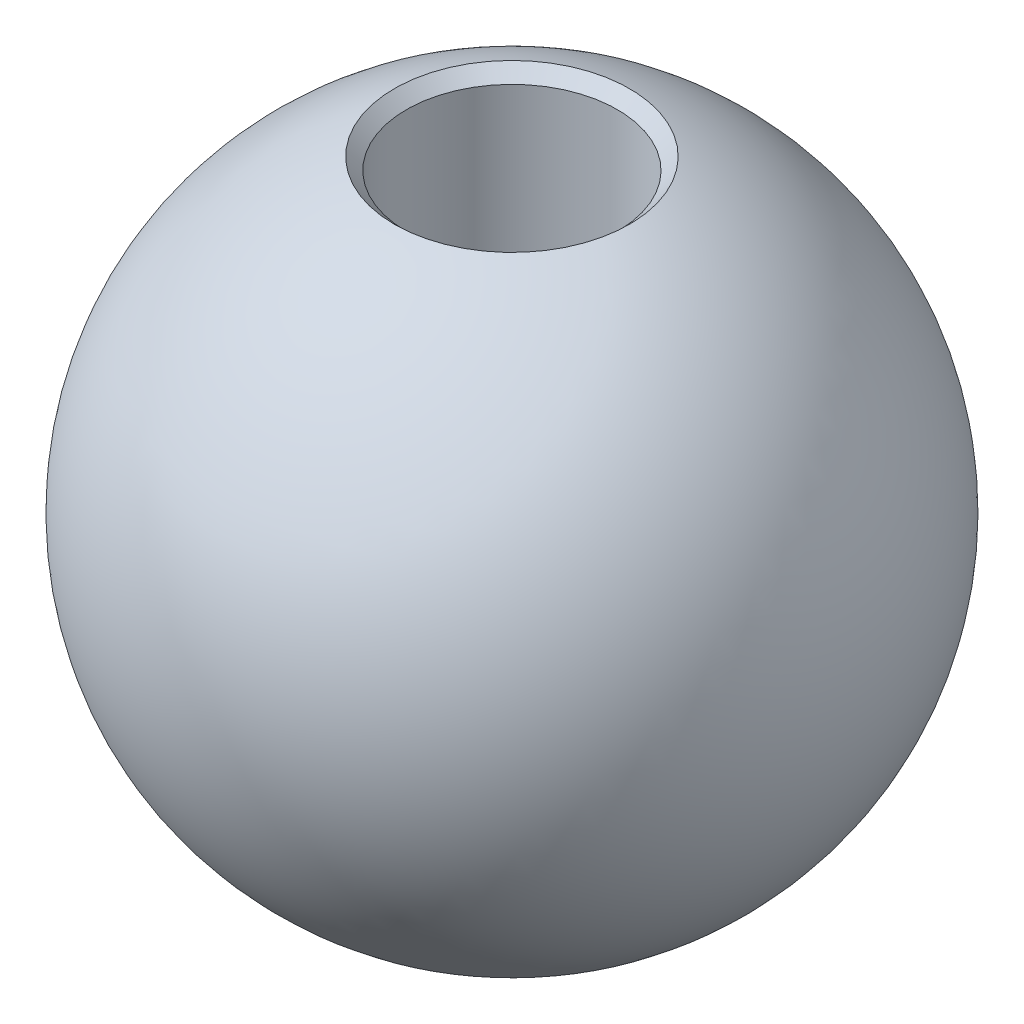
ISO-10303-21;
HEADER;
FILE_DESCRIPTION(('STEP AP214'),'2;1');
FILE_NAME('part.step','',(''),(''),'','','');
FILE_SCHEMA(('AUTOMOTIVE_DESIGN { 1 0 10303 214 1 1 1 1 }'));
ENDSEC;
DATA;
#1=APPLICATION_CONTEXT('core data for automotive mechanical design processes');
#2=APPLICATION_PROTOCOL_DEFINITION('international standard','automotive_design',2000,#1);
#3=PRODUCT_CONTEXT('',#1,'mechanical');
#4=PRODUCT('Part','Part','',(#3));
#5=PRODUCT_RELATED_PRODUCT_CATEGORY('part','',(#4));
#6=PRODUCT_DEFINITION_FORMATION('','',#4);
#7=PRODUCT_DEFINITION_CONTEXT('part definition',#1,'design');
#8=PRODUCT_DEFINITION('design','',#6,#7);
#9=PRODUCT_DEFINITION_SHAPE('','',#8);
#10=(LENGTH_UNIT() NAMED_UNIT(*) SI_UNIT(.MILLI.,.METRE.));
#11=(NAMED_UNIT(*) PLANE_ANGLE_UNIT() SI_UNIT($,.RADIAN.));
#12=(NAMED_UNIT(*) SI_UNIT($,.STERADIAN.) SOLID_ANGLE_UNIT());
#13=UNCERTAINTY_MEASURE_WITH_UNIT(LENGTH_MEASURE(1.E-05),#10,'distance_accuracy_value','');
#14=(GEOMETRIC_REPRESENTATION_CONTEXT(3) GLOBAL_UNCERTAINTY_ASSIGNED_CONTEXT((#13)) GLOBAL_UNIT_ASSIGNED_CONTEXT((#10,
#11,#12)) REPRESENTATION_CONTEXT('',''));
#15=CARTESIAN_POINT('',(0.,0.,0.));
#16=DIRECTION('',(0.,0.,1.));
#17=DIRECTION('',(1.,0.,0.));
#18=AXIS2_PLACEMENT_3D('',#15,#16,#17);
#19=CARTESIAN_POINT('',(0.,0.,0.));
#20=DIRECTION('',(-1.,0.,0.));
#21=DIRECTION('',(0.,1.,0.));
#22=AXIS2_PLACEMENT_3D('',#19,#20,#21);
#23=SPHERICAL_SURFACE('',#22,5.);
#24=CARTESIAN_POINT('',(0.,0.,0.));
#25=DIRECTION('',(0.,1.,0.));
#26=DIRECTION('',(0.,0.,1.));
#27=AXIS2_PLACEMENT_3D('',#24,#25,#26);
#28=SPHERICAL_SURFACE('',#27,5.);
#29=CARTESIAN_POINT('',(0.,-4.67095475910253,0.));
#30=DIRECTION('',(0.,1.,0.));
#31=DIRECTION('',(0.,0.,1.));
#32=AXIS2_PLACEMENT_3D('',#29,#30,#31);
#33=CIRCLE('',#32,1.78386704617172);
#34=CARTESIAN_POINT('',(0.,-4.67095475910253,1.78386704617172));
#35=VERTEX_POINT('',#34);
#36=EDGE_CURVE('E54',#35,#35,#33,.T.);
#37=ORIENTED_EDGE('',*,*,#36,.T.);
#38=EDGE_LOOP('',(#37));
#39=FACE_BOUND('',#38,.T.);
#40=CARTESIAN_POINT('',(0.,4.67095475910253,0.));
#41=DIRECTION('',(0.,-1.,0.));
#42=DIRECTION('',(0.,0.,-1.));
#43=AXIS2_PLACEMENT_3D('',#40,#41,#42);
#44=CIRCLE('',#43,1.78386704617172);
#45=CARTESIAN_POINT('',(0.,4.67095475910253,1.78386704617172));
#46=VERTEX_POINT('',#45);
#47=EDGE_CURVE('E59',#46,#46,#44,.T.);
#48=ORIENTED_EDGE('',*,*,#47,.T.);
#49=EDGE_LOOP('',(#48));
#50=FACE_BOUND('',#49,.T.);
#51=ADVANCED_FACE('F40',(#39,#50),#28,.T.);
#52=CARTESIAN_POINT('',(0.,5.,0.));
#53=DIRECTION('',(0.,1.,0.));
#54=DIRECTION('',(0.,0.,1.));
#55=AXIS2_PLACEMENT_3D('',#52,#53,#54);
#56=CYLINDRICAL_SURFACE('',#55,1.59999999999999);
#57=CARTESIAN_POINT('',(0.,-4.4870877129308,0.));
#58=DIRECTION('',(0.,1.,0.));
#59=DIRECTION('',(0.,0.,1.));
#60=AXIS2_PLACEMENT_3D('',#57,#58,#59);
#61=CIRCLE('',#60,1.59999999999999);
#62=CARTESIAN_POINT('',(0.,-4.4870877129308,1.59999999999999));
#63=VERTEX_POINT('',#62);
#64=EDGE_CURVE('E10',#63,#63,#61,.F.);
#65=ORIENTED_EDGE('',*,*,#64,.T.);
#66=EDGE_LOOP('',(#65));
#67=FACE_BOUND('',#66,.T.);
#68=CARTESIAN_POINT('',(0.,4.4870877129308,0.));
#69=DIRECTION('',(0.,-1.,0.));
#70=DIRECTION('',(0.,0.,-1.));
#71=AXIS2_PLACEMENT_3D('',#68,#69,#70);
#72=CIRCLE('',#71,1.59999999999999);
#73=CARTESIAN_POINT('',(0.,4.4870877129308,1.59999999999999));
#74=VERTEX_POINT('',#73);
#75=EDGE_CURVE('E49',#74,#74,#72,.F.);
#76=ORIENTED_EDGE('',*,*,#75,.T.);
#77=EDGE_LOOP('',(#76));
#78=FACE_BOUND('',#77,.T.);
#79=ADVANCED_FACE('F73',(#67,#78),#56,.F.);
#80=CARTESIAN_POINT('',(0.,-4.67095475910253,0.));
#81=DIRECTION('',(0.,-1.,0.));
#82=DIRECTION('',(0.,0.,-1.));
#83=AXIS2_PLACEMENT_3D('',#80,#81,#82);
#84=CONICAL_SURFACE('',#83,1.78386704617172,0.785398163397441);
#85=ORIENTED_EDGE('',*,*,#64,.F.);
#86=EDGE_LOOP('',(#85));
#87=FACE_BOUND('',#86,.T.);
#88=ORIENTED_EDGE('',*,*,#36,.F.);
#89=EDGE_LOOP('',(#88));
#90=FACE_BOUND('',#89,.T.);
#91=ADVANCED_FACE('F68',(#87,#90),#84,.F.);
#92=CARTESIAN_POINT('',(0.,4.67095475910253,0.));
#93=DIRECTION('',(0.,1.,0.));
#94=DIRECTION('',(0.,0.,1.));
#95=AXIS2_PLACEMENT_3D('',#92,#93,#94);
#96=CONICAL_SURFACE('',#95,1.78386704617172,0.785398163397446);
#97=CARTESIAN_POINT('',(0.,4.4870877129308,1.59999999999999));
#98=CARTESIAN_POINT('',(0.,4.48900299466176,1.60191528173095));
#99=CARTESIAN_POINT('',(0.,4.49091827639272,1.6038305634619));
#100=CARTESIAN_POINT('',(0.,4.49474883985463,1.60766112692381));
#101=CARTESIAN_POINT('',(0.,4.49666412158558,1.60957640865477));
#102=CARTESIAN_POINT('',(0.,4.50049468504749,1.61340697211668));
#103=CARTESIAN_POINT('',(0.,4.50240996677845,1.61532225384764));
#104=CARTESIAN_POINT('',(0.,4.50624053024036,1.61915281730955));
#105=CARTESIAN_POINT('',(0.,4.50815581197131,1.6210680990405));
#106=CARTESIAN_POINT('',(0.,4.51198637543323,1.62489866250241));
#107=CARTESIAN_POINT('',(0.,4.51390165716418,1.62681394423337));
#108=CARTESIAN_POINT('',(0.,4.51773222062609,1.63064450769528));
#109=CARTESIAN_POINT('',(0.,4.51964750235705,1.63255978942623));
#110=CARTESIAN_POINT('',(0.,4.52347806581896,1.63639035288815));
#111=CARTESIAN_POINT('',(0.,4.52539334754991,1.6383056346191));
#112=CARTESIAN_POINT('',(0.,4.52922391101182,1.64213619808101));
#113=CARTESIAN_POINT('',(0.,4.53113919274278,1.64405147981197));
#114=CARTESIAN_POINT('',(0.,4.53496975620469,1.64788204327388));
#115=CARTESIAN_POINT('',(0.,4.53688503793565,1.64979732500483));
#116=CARTESIAN_POINT('',(0.,4.54071560139756,1.65362788846674));
#117=CARTESIAN_POINT('',(0.,4.54263088312851,1.6555431701977));
#118=CARTESIAN_POINT('',(0.,4.54646144659042,1.65937373365961));
#119=CARTESIAN_POINT('',(0.,4.54837672832138,1.66128901539057));
#120=CARTESIAN_POINT('',(0.,4.55220729178329,1.66511957885248));
#121=CARTESIAN_POINT('',(0.,4.55412257351425,1.66703486058343));
#122=CARTESIAN_POINT('',(0.,4.55795313697616,1.67086542404534));
#123=CARTESIAN_POINT('',(0.,4.55986841870711,1.6727807057763));
#124=CARTESIAN_POINT('',(0.,4.56369898216902,1.67661126923821));
#125=CARTESIAN_POINT('',(0.,4.56561426389998,1.67852655096917));
#126=CARTESIAN_POINT('',(0.,4.56944482736189,1.68235711443108));
#127=CARTESIAN_POINT('',(0.,4.57136010909285,1.68427239616203));
#128=CARTESIAN_POINT('',(0.,4.57519067255476,1.68810295962394));
#129=CARTESIAN_POINT('',(0.,4.57710595428571,1.6900182413549));
#130=CARTESIAN_POINT('',(0.,4.58093651774762,1.69384880481681));
#131=CARTESIAN_POINT('',(0.,4.58285179947858,1.69576408654777));
#132=CARTESIAN_POINT('',(0.,4.58668236294049,1.69959465000968));
#133=CARTESIAN_POINT('',(0.,4.58859764467144,1.70150993174063));
#134=CARTESIAN_POINT('',(0.,4.59242820813335,1.70534049520254));
#135=CARTESIAN_POINT('',(0.,4.59434348986431,1.7072557769335));
#136=CARTESIAN_POINT('',(0.,4.59817405332622,1.71108634039541));
#137=CARTESIAN_POINT('',(0.,4.60008933505718,1.71300162212636));
#138=CARTESIAN_POINT('',(0.,4.60391989851909,1.71683218558828));
#139=CARTESIAN_POINT('',(0.,4.60583518025004,1.71874746731923));
#140=CARTESIAN_POINT('',(0.,4.60966574371195,1.72257803078114));
#141=CARTESIAN_POINT('',(0.,4.61158102544291,1.7244933125121));
#142=CARTESIAN_POINT('',(0.,4.61541158890482,1.72832387597401));
#143=CARTESIAN_POINT('',(0.,4.61732687063578,1.73023915770496));
#144=CARTESIAN_POINT('',(0.,4.62115743409769,1.73406972116687));
#145=CARTESIAN_POINT('',(0.,4.62307271582864,1.73598500289783));
#146=CARTESIAN_POINT('',(0.,4.62690327929055,1.73981556635974));
#147=CARTESIAN_POINT('',(0.,4.62881856102151,1.7417308480907));
#148=CARTESIAN_POINT('',(0.,4.63264912448342,1.74556141155261));
#149=CARTESIAN_POINT('',(0.,4.63456440621438,1.74747669328356));
#150=CARTESIAN_POINT('',(0.,4.63839496967629,1.75130725674547));
#151=CARTESIAN_POINT('',(0.,4.64031025140724,1.75322253847643));
#152=CARTESIAN_POINT('',(0.,4.64414081486915,1.75705310193834));
#153=CARTESIAN_POINT('',(0.,4.64605609660011,1.7589683836693));
#154=CARTESIAN_POINT('',(0.,4.64988666006202,1.76279894713121));
#155=CARTESIAN_POINT('',(0.,4.65180194179298,1.76471422886216));
#156=CARTESIAN_POINT('',(0.,4.65563250525489,1.76854479232407));
#157=CARTESIAN_POINT('',(0.,4.65754778698584,1.77046007405503));
#158=CARTESIAN_POINT('',(0.,4.66137835044775,1.77429063751694));
#159=CARTESIAN_POINT('',(0.,4.66329363217871,1.77620591924789));
#160=CARTESIAN_POINT('',(0.,4.66712419564062,1.78003648270981));
#161=CARTESIAN_POINT('',(0.,4.66903947737157,1.78195176444076));
#162=CARTESIAN_POINT('',(0.,4.67095475910253,1.78386704617172));
#163=B_SPLINE_CURVE_WITH_KNOTS('',3,(#97,#98,#99,#100,#101,#102,#103,#104,#105,#106,#107,#108,
#109,#110,#111,#112,#113,#114,#115,#116,#117,#118,#119,#120,#121,#122,#123,#124,#125,#126,#127,
#128,#129,#130,#131,#132,#133,#134,#135,#136,#137,#138,#139,#140,#141,#142,#143,#144,#145,#146,
#147,#148,#149,#150,#151,#152,#153,#154,#155,#156,#157,#158,#159,#160,#161,#162),.UNSPECIFIED.,
.F.,.F.,(4,2,2,2,2,2,2,2,2,2,2,2,2,2,2,2,2,2,2,2,2,2,2,2,2,2,2,2,2,2,2,2,4),(0.,
0.00812585219904755,0.0162517043980957,0.0243775565971433,0.0325034087961914,0.0406292609952391,
0.0487551131942873,0.0568809653933348,0.065006817592383,0.0731326697914312,0.0812585219904787,
0.0893843741895269,0.0975102263885746,0.105636078587623,0.11376193078667,0.121887782985718,
0.130013635184767,0.138139487383814,0.146265339582862,0.15439119178191,0.162517043980958,
0.170642896180006,0.178768748379054,0.186894600578101,0.19502045277715,0.203146304976198,
0.211272157175245,0.219398009374293,0.227523861573341,0.235649713772389,0.243775565971437,
0.251901418170485,0.260027270369533),.UNSPECIFIED.);
#164=EDGE_CURVE('BSEAM43',#74,#46,#163,.T.);
#165=ORIENTED_EDGE('',*,*,#75,.F.);
#166=ORIENTED_EDGE('',*,*,#47,.F.);
#167=ORIENTED_EDGE('',*,*,#164,.T.);
#168=ORIENTED_EDGE('',*,*,#164,.F.);
#169=EDGE_LOOP('',(#165,#167,#166,#168));
#170=FACE_BOUND('',#169,.T.);
#171=ADVANCED_FACE('F43',(#170),#96,.F.);
#172=CLOSED_SHELL('',(#51,#79,#91,#171));
#173=MANIFOLD_SOLID_BREP('B2',#172);
#174=ADVANCED_BREP_SHAPE_REPRESENTATION('',(#18,#173),#14);
#175=SHAPE_DEFINITION_REPRESENTATION(#9,#174);
ENDSEC;
END-ISO-10303-21;
